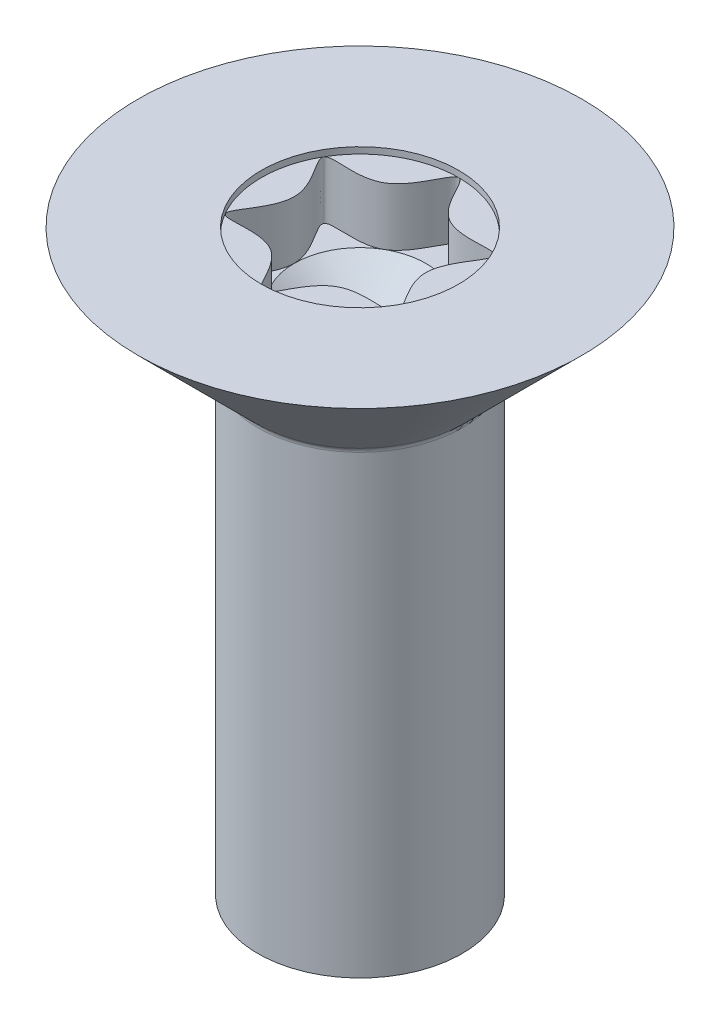
ISO-10303-21;
HEADER;
FILE_DESCRIPTION(('STEP AP214'),'2;1');
FILE_NAME('part.step','',(''),(''),'','','');
FILE_SCHEMA(('AUTOMOTIVE_DESIGN { 1 0 10303 214 1 1 1 1 }'));
ENDSEC;
DATA;
#1=APPLICATION_CONTEXT('core data for automotive mechanical design processes');
#2=APPLICATION_PROTOCOL_DEFINITION('international standard','automotive_design',2000,#1);
#3=PRODUCT_CONTEXT('',#1,'mechanical');
#4=PRODUCT('Part','Part','',(#3));
#5=PRODUCT_RELATED_PRODUCT_CATEGORY('part','',(#4));
#6=PRODUCT_DEFINITION_FORMATION('','',#4);
#7=PRODUCT_DEFINITION_CONTEXT('part definition',#1,'design');
#8=PRODUCT_DEFINITION('design','',#6,#7);
#9=PRODUCT_DEFINITION_SHAPE('','',#8);
#10=(LENGTH_UNIT() NAMED_UNIT(*) SI_UNIT(.MILLI.,.METRE.));
#11=(NAMED_UNIT(*) PLANE_ANGLE_UNIT() SI_UNIT($,.RADIAN.));
#12=(NAMED_UNIT(*) SI_UNIT($,.STERADIAN.) SOLID_ANGLE_UNIT());
#13=UNCERTAINTY_MEASURE_WITH_UNIT(LENGTH_MEASURE(1.E-05),#10,'distance_accuracy_value','');
#14=(GEOMETRIC_REPRESENTATION_CONTEXT(3) GLOBAL_UNCERTAINTY_ASSIGNED_CONTEXT((#13)) GLOBAL_UNIT_ASSIGNED_CONTEXT((#10,
#11,#12)) REPRESENTATION_CONTEXT('',''));
#15=CARTESIAN_POINT('',(0.,0.,0.));
#16=DIRECTION('',(0.,0.,1.));
#17=DIRECTION('',(1.,0.,0.));
#18=AXIS2_PLACEMENT_3D('',#15,#16,#17);
#19=CARTESIAN_POINT('',(0.,7.29,1.4));
#20=DIRECTION('',(0.,1.,0.));
#21=DIRECTION('',(0.,0.,1.));
#22=AXIS2_PLACEMENT_3D('',#19,#20,#21);
#23=PLANE('',#22);
#24=CARTESIAN_POINT('',(0.,7.29,-1.4));
#25=CARTESIAN_POINT('',(0.100650938672069,7.29,-1.4));
#26=CARTESIAN_POINT('',(0.301952816016209,7.29,-0.522997618828571));
#27=CARTESIAN_POINT('',(1.59218873593516,7.29,-0.919250595292857));
#28=CARTESIAN_POINT('',(0.603905632032417,7.29,0.));
#29=CARTESIAN_POINT('',(1.59218873593516,7.29,0.919250595292857));
#30=CARTESIAN_POINT('',(0.301952816016209,7.29,0.52299761882857));
#31=CARTESIAN_POINT('',(0.,7.29,1.83850119058572));
#32=CARTESIAN_POINT('',(-0.301952816016208,7.29,0.522997618828569));
#33=CARTESIAN_POINT('',(-1.59218873593516,7.29,0.919250595292859));
#34=CARTESIAN_POINT('',(-0.603905632032418,7.29,0.));
#35=CARTESIAN_POINT('',(-1.59218873593517,7.29,-0.919250595292858));
#36=CARTESIAN_POINT('',(-0.301952816016208,7.29,-0.52299761882857));
#37=CARTESIAN_POINT('',(-0.100650938672069,7.29,-1.4));
#38=CARTESIAN_POINT('',(0.,7.29,-1.4));
#39=B_SPLINE_CURVE_WITH_KNOTS('',3,(#24,#25,#26,#27,#28,#29,#30,#31,#32,#33,#34,#35,#36,#37,
#38),.UNSPECIFIED.,.T.,.F.,(4,1,1,1,1,1,1,1,1,1,1,1,4),(0.,0.0833333333333334,0.166666666666667,
0.25,0.333333333333333,0.416666666666667,0.5,0.583333333333333,0.666666666666667,0.75,
0.833333333333333,0.916666666666667,1.),.UNSPECIFIED.);
#40=CARTESIAN_POINT('',(0.466666666666667,7.29,-0.808290376865476));
#41=VERTEX_POINT('',#40);
#42=CARTESIAN_POINT('',(0.933333333333333,7.29,0.));
#43=VERTEX_POINT('',#42);
#44=EDGE_CURVE('E132',#41,#43,#39,.T.);
#45=ORIENTED_EDGE('',*,*,#44,.F.);
#46=CARTESIAN_POINT('',(0.,7.29,0.));
#47=DIRECTION('',(0.,-1.,0.));
#48=DIRECTION('',(0.,0.,-1.));
#49=AXIS2_PLACEMENT_3D('',#46,#47,#48);
#50=CIRCLE('',#49,0.933333333333333);
#51=EDGE_CURVE('E47',#41,#43,#50,.T.);
#52=ORIENTED_EDGE('',*,*,#51,.T.);
#53=EDGE_LOOP('',(#45,#52));
#54=FACE_BOUND('',#53,.T.);
#55=ADVANCED_FACE('F32',(#54),#23,.T.);
#56=CARTESIAN_POINT('',(0.466666666666666,7.29,0.808290376865476));
#57=VERTEX_POINT('',#56);
#58=EDGE_CURVE('E147',#43,#57,#39,.T.);
#59=ORIENTED_EDGE('',*,*,#58,.F.);
#60=EDGE_CURVE('E186',#43,#57,#50,.T.);
#61=ORIENTED_EDGE('',*,*,#60,.T.);
#62=EDGE_LOOP('',(#59,#61));
#63=FACE_BOUND('',#62,.T.);
#64=ADVANCED_FACE('F100',(#63),#23,.T.);
#65=CARTESIAN_POINT('',(-0.466666666666667,7.29,0.808290376865476));
#66=VERTEX_POINT('',#65);
#67=EDGE_CURVE('E140',#57,#66,#39,.T.);
#68=ORIENTED_EDGE('',*,*,#67,.F.);
#69=EDGE_CURVE('E189',#57,#66,#50,.T.);
#70=ORIENTED_EDGE('',*,*,#69,.T.);
#71=EDGE_LOOP('',(#68,#70));
#72=FACE_BOUND('',#71,.T.);
#73=ADVANCED_FACE('F107',(#72),#23,.T.);
#74=CARTESIAN_POINT('',(-0.933333333333333,7.29,0.));
#75=VERTEX_POINT('',#74);
#76=EDGE_CURVE('E138',#66,#75,#39,.T.);
#77=ORIENTED_EDGE('',*,*,#76,.F.);
#78=EDGE_CURVE('E194',#66,#75,#50,.T.);
#79=ORIENTED_EDGE('',*,*,#78,.T.);
#80=EDGE_LOOP('',(#77,#79));
#81=FACE_BOUND('',#80,.T.);
#82=ADVANCED_FACE('F121',(#81),#23,.T.);
#83=CARTESIAN_POINT('',(-0.466666666666666,7.29,-0.808290376865476));
#84=VERTEX_POINT('',#83);
#85=EDGE_CURVE('E129',#75,#84,#39,.T.);
#86=ORIENTED_EDGE('',*,*,#85,.F.);
#87=EDGE_CURVE('E197',#75,#84,#50,.T.);
#88=ORIENTED_EDGE('',*,*,#87,.T.);
#89=EDGE_LOOP('',(#86,#88));
#90=FACE_BOUND('',#89,.T.);
#91=ADVANCED_FACE('F113',(#90),#23,.T.);
#92=EDGE_CURVE('E125',#84,#41,#39,.T.);
#93=ORIENTED_EDGE('',*,*,#92,.F.);
#94=EDGE_CURVE('E127',#84,#41,#50,.T.);
#95=ORIENTED_EDGE('',*,*,#94,.T.);
#96=EDGE_LOOP('',(#93,#95));
#97=FACE_BOUND('',#96,.T.);
#98=ADVANCED_FACE('F103',(#97),#23,.T.);
#99=CARTESIAN_POINT('',(0.,8.2,0.));
#100=DIRECTION('',(0.,1.,0.));
#101=DIRECTION('',(0.,0.,1.));
#102=AXIS2_PLACEMENT_3D('',#99,#100,#101);
#103=PLANE('',#102);
#104=CARTESIAN_POINT('',(0.,8.2,0.));
#105=DIRECTION('',(0.,1.,0.));
#106=DIRECTION('',(0.,0.,1.));
#107=AXIS2_PLACEMENT_3D('',#104,#105,#106);
#108=CIRCLE('',#107,1.4);
#109=CARTESIAN_POINT('',(0.,8.2,1.4));
#110=VERTEX_POINT('',#109);
#111=EDGE_CURVE('E148',#110,#110,#108,.T.);
#112=ORIENTED_EDGE('',*,*,#111,.F.);
#113=EDGE_LOOP('',(#112));
#114=FACE_BOUND('',#113,.T.);
#115=CARTESIAN_POINT('',(0.,8.2,0.));
#116=DIRECTION('',(0.,-1.,0.));
#117=DIRECTION('',(0.,0.,-1.));
#118=AXIS2_PLACEMENT_3D('',#115,#116,#117);
#119=CIRCLE('',#118,3.15);
#120=CARTESIAN_POINT('',(0.,8.2,-3.15));
#121=VERTEX_POINT('',#120);
#122=EDGE_CURVE('E172',#121,#121,#119,.T.);
#123=ORIENTED_EDGE('',*,*,#122,.F.);
#124=EDGE_LOOP('',(#123));
#125=FACE_BOUND('',#124,.T.);
#126=ADVANCED_FACE('F112',(#114,#125),#103,.T.);
#127=CARTESIAN_POINT('',(0.,6.5,0.));
#128=DIRECTION('',(0.,1.,0.));
#129=DIRECTION('',(0.,0.,1.));
#130=AXIS2_PLACEMENT_3D('',#127,#128,#129);
#131=CONICAL_SURFACE('',#130,1.44999999999998,0.785398163397453);
#132=CARTESIAN_POINT('',(0.,6.52928932188134,0.));
#133=DIRECTION('',(0.,1.,0.));
#134=DIRECTION('',(0.,0.,1.));
#135=AXIS2_PLACEMENT_3D('',#132,#133,#134);
#136=CIRCLE('',#135,1.47928932188133);
#137=CARTESIAN_POINT('',(0.,6.52928932188134,1.47928932188133));
#138=VERTEX_POINT('',#137);
#139=EDGE_CURVE('E11',#138,#138,#136,.T.);
#140=ORIENTED_EDGE('',*,*,#139,.T.);
#141=EDGE_LOOP('',(#140));
#142=FACE_BOUND('',#141,.T.);
#143=ORIENTED_EDGE('',*,*,#122,.T.);
#144=EDGE_LOOP('',(#143));
#145=FACE_BOUND('',#144,.T.);
#146=ADVANCED_FACE('F119',(#142,#145),#131,.T.);
#147=CARTESIAN_POINT('',(0.,0.,0.));
#148=DIRECTION('',(0.,-1.,0.));
#149=DIRECTION('',(0.,0.,-1.));
#150=AXIS2_PLACEMENT_3D('',#147,#148,#149);
#151=CYLINDRICAL_SURFACE('',#150,1.44999999999998);
#152=CARTESIAN_POINT('',(0.,6.45857864376269,0.));
#153=DIRECTION('',(0.,-1.,0.));
#154=DIRECTION('',(0.,0.,-1.));
#155=AXIS2_PLACEMENT_3D('',#152,#153,#154);
#156=CIRCLE('',#155,1.44999999999998);
#157=CARTESIAN_POINT('',(0.,6.45857864376269,-1.44999999999998));
#158=VERTEX_POINT('',#157);
#159=EDGE_CURVE('E40',#158,#158,#156,.T.);
#160=ORIENTED_EDGE('',*,*,#159,.T.);
#161=EDGE_LOOP('',(#160));
#162=FACE_BOUND('',#161,.T.);
#163=CARTESIAN_POINT('',(0.,0.,0.));
#164=DIRECTION('',(0.,-1.,0.));
#165=DIRECTION('',(0.,0.,-1.));
#166=AXIS2_PLACEMENT_3D('',#163,#164,#165);
#167=CIRCLE('',#166,1.44999999999998);
#168=CARTESIAN_POINT('',(0.,0.,-1.44999999999998));
#169=VERTEX_POINT('',#168);
#170=EDGE_CURVE('E146',#169,#169,#167,.T.);
#171=ORIENTED_EDGE('',*,*,#170,.F.);
#172=EDGE_LOOP('',(#171));
#173=FACE_BOUND('',#172,.T.);
#174=ADVANCED_FACE('F159',(#162,#173),#151,.T.);
#175=CARTESIAN_POINT('',(1.44999999999998,0.,0.));
#176=DIRECTION('',(0.,-1.,0.));
#177=DIRECTION('',(0.,0.,-1.));
#178=AXIS2_PLACEMENT_3D('',#175,#176,#177);
#179=PLANE('',#178);
#180=ORIENTED_EDGE('',*,*,#170,.T.);
#181=EDGE_LOOP('',(#180));
#182=FACE_BOUND('',#181,.T.);
#183=ADVANCED_FACE('F155',(#182),#179,.T.);
#184=CARTESIAN_POINT('',(0.,8.109,0.));
#185=DIRECTION('',(0.,1.,0.));
#186=DIRECTION('',(0.,0.,1.));
#187=AXIS2_PLACEMENT_3D('',#184,#185,#186);
#188=CYLINDRICAL_SURFACE('',#187,1.4);
#189=ORIENTED_EDGE('',*,*,#111,.T.);
#190=EDGE_LOOP('',(#189));
#191=FACE_BOUND('',#190,.T.);
#192=CARTESIAN_POINT('',(0.,8.109,0.));
#193=DIRECTION('',(0.,1.,0.));
#194=DIRECTION('',(0.,0.,1.));
#195=AXIS2_PLACEMENT_3D('',#192,#193,#194);
#196=CIRCLE('',#195,1.4);
#197=CARTESIAN_POINT('',(1.21243556529821,8.109,0.699999999999999));
#198=VERTEX_POINT('',#197);
#199=CARTESIAN_POINT('',(1.21243556529821,8.109,-0.7));
#200=VERTEX_POINT('',#199);
#201=EDGE_CURVE('E211',#198,#200,#196,.T.);
#202=ORIENTED_EDGE('',*,*,#201,.F.);
#203=CARTESIAN_POINT('',(0.,8.109,1.4));
#204=VERTEX_POINT('',#203);
#205=EDGE_CURVE('E130',#204,#198,#196,.T.);
#206=ORIENTED_EDGE('',*,*,#205,.F.);
#207=CARTESIAN_POINT('',(-1.21243556529821,8.109,0.700000000000001));
#208=VERTEX_POINT('',#207);
#209=EDGE_CURVE('E196',#208,#204,#196,.T.);
#210=ORIENTED_EDGE('',*,*,#209,.F.);
#211=CARTESIAN_POINT('',(-1.21243556529821,8.109,-0.7));
#212=VERTEX_POINT('',#211);
#213=EDGE_CURVE('E219',#212,#208,#196,.T.);
#214=ORIENTED_EDGE('',*,*,#213,.F.);
#215=CARTESIAN_POINT('',(0.,8.109,-1.4));
#216=VERTEX_POINT('',#215);
#217=EDGE_CURVE('E222',#216,#212,#196,.T.);
#218=ORIENTED_EDGE('',*,*,#217,.F.);
#219=EDGE_CURVE('E54',#200,#216,#196,.T.);
#220=ORIENTED_EDGE('',*,*,#219,.F.);
#221=EDGE_LOOP('',(#202,#206,#210,#214,#218,#220));
#222=FACE_BOUND('',#221,.T.);
#223=ADVANCED_FACE('F158',(#191,#222),#188,.F.);
#224=CARTESIAN_POINT('',(0.,8.109,0.));
#225=DIRECTION('',(0.,1.,0.));
#226=DIRECTION('',(0.,0.,1.));
#227=AXIS2_PLACEMENT_3D('',#224,#225,#226);
#228=PLANE('',#227);
#229=ORIENTED_EDGE('',*,*,#217,.T.);
#230=CARTESIAN_POINT('',(0.,8.109,-1.4));
#231=CARTESIAN_POINT('',(0.100650938672069,8.109,-1.4));
#232=CARTESIAN_POINT('',(0.301952816016209,8.109,-0.522997618828571));
#233=CARTESIAN_POINT('',(1.59218873593516,8.109,-0.919250595292857));
#234=CARTESIAN_POINT('',(0.603905632032417,8.109,0.));
#235=CARTESIAN_POINT('',(1.59218873593516,8.109,0.919250595292857));
#236=CARTESIAN_POINT('',(0.301952816016209,8.109,0.52299761882857));
#237=CARTESIAN_POINT('',(0.,8.109,1.83850119058572));
#238=CARTESIAN_POINT('',(-0.301952816016208,8.109,0.522997618828569));
#239=CARTESIAN_POINT('',(-1.59218873593516,8.109,0.919250595292859));
#240=CARTESIAN_POINT('',(-0.603905632032418,8.109,0.));
#241=CARTESIAN_POINT('',(-1.59218873593517,8.109,-0.919250595292858));
#242=CARTESIAN_POINT('',(-0.301952816016208,8.109,-0.52299761882857));
#243=CARTESIAN_POINT('',(-0.100650938672069,8.109,-1.4));
#244=CARTESIAN_POINT('',(0.,8.109,-1.4));
#245=B_SPLINE_CURVE_WITH_KNOTS('',3,(#230,#231,#232,#233,#234,#235,#236,#237,#238,#239,#240,
#241,#242,#243,#244),.UNSPECIFIED.,.T.,.F.,(4,1,1,1,1,1,1,1,1,1,1,1,4),(0.,0.0833333333333334,
0.166666666666667,0.25,0.333333333333333,0.416666666666667,0.5,0.583333333333333,
0.666666666666667,0.75,0.833333333333333,0.916666666666667,1.),.UNSPECIFIED.);
#246=EDGE_CURVE('E178',#216,#212,#245,.F.);
#247=ORIENTED_EDGE('',*,*,#246,.F.);
#248=EDGE_LOOP('',(#229,#247));
#249=FACE_BOUND('',#248,.T.);
#250=ADVANCED_FACE('F227',(#249),#228,.T.);
#251=ORIENTED_EDGE('',*,*,#213,.T.);
#252=EDGE_CURVE('E199',#212,#208,#245,.F.);
#253=ORIENTED_EDGE('',*,*,#252,.F.);
#254=EDGE_LOOP('',(#251,#253));
#255=FACE_BOUND('',#254,.T.);
#256=ADVANCED_FACE('F229',(#255),#228,.T.);
#257=ORIENTED_EDGE('',*,*,#209,.T.);
#258=EDGE_CURVE('E202',#208,#204,#245,.F.);
#259=ORIENTED_EDGE('',*,*,#258,.F.);
#260=EDGE_LOOP('',(#257,#259));
#261=FACE_BOUND('',#260,.T.);
#262=ADVANCED_FACE('F234',(#261),#228,.T.);
#263=ORIENTED_EDGE('',*,*,#205,.T.);
#264=EDGE_CURVE('E204',#204,#198,#245,.F.);
#265=ORIENTED_EDGE('',*,*,#264,.F.);
#266=EDGE_LOOP('',(#263,#265));
#267=FACE_BOUND('',#266,.T.);
#268=ADVANCED_FACE('F217',(#267),#228,.T.);
#269=ORIENTED_EDGE('',*,*,#201,.T.);
#270=EDGE_CURVE('E176',#198,#200,#245,.F.);
#271=ORIENTED_EDGE('',*,*,#270,.F.);
#272=EDGE_LOOP('',(#269,#271));
#273=FACE_BOUND('',#272,.T.);
#274=ADVANCED_FACE('F210',(#273),#228,.T.);
#275=ORIENTED_EDGE('',*,*,#219,.T.);
#276=EDGE_CURVE('E174',#200,#216,#245,.F.);
#277=ORIENTED_EDGE('',*,*,#276,.F.);
#278=EDGE_LOOP('',(#275,#277));
#279=FACE_BOUND('',#278,.T.);
#280=ADVANCED_FACE('F95',(#279),#228,.T.);
#281=DIRECTION('',(0.,1.,0.));
#282=VECTOR('',#281,1.);
#283=SURFACE_OF_LINEAR_EXTRUSION('',#39,#282);
#284=ORIENTED_EDGE('',*,*,#44,.T.);
#285=ORIENTED_EDGE('',*,*,#58,.T.);
#286=ORIENTED_EDGE('',*,*,#67,.T.);
#287=ORIENTED_EDGE('',*,*,#76,.T.);
#288=ORIENTED_EDGE('',*,*,#85,.T.);
#289=ORIENTED_EDGE('',*,*,#92,.T.);
#290=EDGE_LOOP('',(#284,#285,#286,#287,#288,#289));
#291=FACE_BOUND('',#290,.T.);
#292=ORIENTED_EDGE('',*,*,#276,.T.);
#293=ORIENTED_EDGE('',*,*,#246,.T.);
#294=ORIENTED_EDGE('',*,*,#252,.T.);
#295=ORIENTED_EDGE('',*,*,#258,.T.);
#296=ORIENTED_EDGE('',*,*,#264,.T.);
#297=ORIENTED_EDGE('',*,*,#270,.T.);
#298=EDGE_LOOP('',(#292,#293,#294,#295,#296,#297));
#299=FACE_BOUND('',#298,.T.);
#300=ADVANCED_FACE('F88',(#291,#299),#283,.T.);
#301=CARTESIAN_POINT('',(0.,6.67,0.));
#302=DIRECTION('',(0.,1.,0.));
#303=DIRECTION('',(0.,0.,1.));
#304=AXIS2_PLACEMENT_3D('',#301,#302,#303);
#305=CONICAL_SURFACE('',#304,0.,0.984443886766008);
#306=ORIENTED_EDGE('',*,*,#51,.F.);
#307=ORIENTED_EDGE('',*,*,#94,.F.);
#308=ORIENTED_EDGE('',*,*,#87,.F.);
#309=ORIENTED_EDGE('',*,*,#78,.F.);
#310=ORIENTED_EDGE('',*,*,#69,.F.);
#311=ORIENTED_EDGE('',*,*,#60,.F.);
#312=EDGE_LOOP('',(#306,#307,#308,#309,#310,#311));
#313=FACE_BOUND('',#312,.T.);
#314=CARTESIAN_POINT('',(0.,6.67,0.));
#315=VERTEX_POINT('',#314);
#316=VERTEX_LOOP('',#315);
#317=FACE_BOUND('',#316,.T.);
#318=ADVANCED_FACE('F86',(#313,#317),#305,.F.);
#319=CARTESIAN_POINT('',(0.,6.45857864376269,0.));
#320=DIRECTION('',(0.,-1.,0.));
#321=DIRECTION('',(0.,0.,-1.));
#322=AXIS2_PLACEMENT_3D('',#319,#320,#321);
#323=TOROIDAL_SURFACE('',#322,1.54999999999998,0.1);
#324=ORIENTED_EDGE('',*,*,#139,.F.);
#325=EDGE_LOOP('',(#324));
#326=FACE_BOUND('',#325,.T.);
#327=ORIENTED_EDGE('',*,*,#159,.F.);
#328=EDGE_LOOP('',(#327));
#329=FACE_BOUND('',#328,.T.);
#330=ADVANCED_FACE('F34',(#326,#329),#323,.F.);
#331=CLOSED_SHELL('',(#55,#64,#73,#82,#91,#98,#126,#146,#174,#183,#223,#250,#256,#262,#268,#274,
#280,#300,#318,#330));
#332=MANIFOLD_SOLID_BREP('B2',#331);
#333=ADVANCED_BREP_SHAPE_REPRESENTATION('',(#18,#332),#14);
#334=SHAPE_DEFINITION_REPRESENTATION(#9,#333);
ENDSEC;
END-ISO-10303-21;
